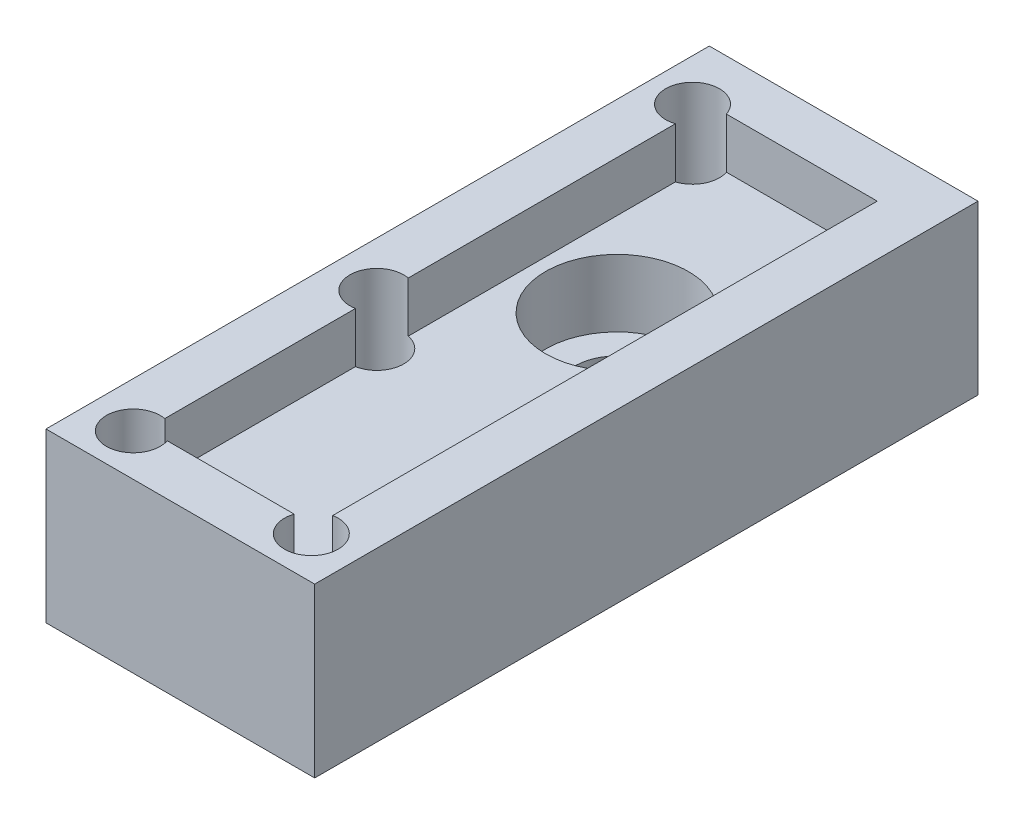
ISO-10303-21;
HEADER;
FILE_DESCRIPTION(('STEP AP214'),'2;1');
FILE_NAME('part.step','',(''),(''),'','','');
FILE_SCHEMA(('AUTOMOTIVE_DESIGN { 1 0 10303 214 1 1 1 1 }'));
ENDSEC;
DATA;
#1=APPLICATION_CONTEXT('core data for automotive mechanical design processes');
#2=APPLICATION_PROTOCOL_DEFINITION('international standard','automotive_design',2000,#1);
#3=PRODUCT_CONTEXT('',#1,'mechanical');
#4=PRODUCT('Part','Part','',(#3));
#5=PRODUCT_RELATED_PRODUCT_CATEGORY('part','',(#4));
#6=PRODUCT_DEFINITION_FORMATION('','',#4);
#7=PRODUCT_DEFINITION_CONTEXT('part definition',#1,'design');
#8=PRODUCT_DEFINITION('design','',#6,#7);
#9=PRODUCT_DEFINITION_SHAPE('','',#8);
#10=(LENGTH_UNIT() NAMED_UNIT(*) SI_UNIT(.MILLI.,.METRE.));
#11=(NAMED_UNIT(*) PLANE_ANGLE_UNIT() SI_UNIT($,.RADIAN.));
#12=(NAMED_UNIT(*) SI_UNIT($,.STERADIAN.) SOLID_ANGLE_UNIT());
#13=UNCERTAINTY_MEASURE_WITH_UNIT(LENGTH_MEASURE(1.E-05),#10,'distance_accuracy_value','');
#14=(GEOMETRIC_REPRESENTATION_CONTEXT(3) GLOBAL_UNCERTAINTY_ASSIGNED_CONTEXT((#13)) GLOBAL_UNIT_ASSIGNED_CONTEXT((#10,
#11,#12)) REPRESENTATION_CONTEXT('',''));
#15=CARTESIAN_POINT('',(0.,0.,0.));
#16=DIRECTION('',(0.,0.,1.));
#17=DIRECTION('',(1.,0.,0.));
#18=AXIS2_PLACEMENT_3D('',#15,#16,#17);
#19=CARTESIAN_POINT('',(8.,-8.,-26.));
#20=DIRECTION('',(0.,1.,0.));
#21=DIRECTION('',(0.,0.,1.));
#22=AXIS2_PLACEMENT_3D('',#19,#20,#21);
#23=CYLINDRICAL_SURFACE('',#22,2.5);
#24=CARTESIAN_POINT('',(8.,8.,-26.));
#25=DIRECTION('',(0.,1.,0.));
#26=DIRECTION('',(0.,0.,1.));
#27=AXIS2_PLACEMENT_3D('',#24,#25,#26);
#28=CIRCLE('',#27,2.5);
#29=CARTESIAN_POINT('',(8.,8.,-23.5));
#30=VERTEX_POINT('',#29);
#31=EDGE_CURVE('E165',#30,#30,#28,.F.);
#32=ORIENTED_EDGE('',*,*,#31,.F.);
#33=EDGE_LOOP('',(#32));
#34=FACE_BOUND('',#33,.T.);
#35=CARTESIAN_POINT('',(8.,5.,-26.));
#36=DIRECTION('',(0.,-1.,0.));
#37=DIRECTION('',(0.,0.,-1.));
#38=AXIS2_PLACEMENT_3D('',#35,#36,#37);
#39=CIRCLE('',#38,2.5);
#40=CARTESIAN_POINT('',(8.,5.,-28.5));
#41=VERTEX_POINT('',#40);
#42=EDGE_CURVE('E179',#41,#41,#39,.F.);
#43=ORIENTED_EDGE('',*,*,#42,.F.);
#44=EDGE_LOOP('',(#43));
#45=FACE_BOUND('',#44,.T.);
#46=ADVANCED_FACE('F33',(#34,#45),#23,.F.);
#47=CARTESIAN_POINT('',(0.,15.,0.));
#48=DIRECTION('',(1.,0.,0.));
#49=DIRECTION('',(0.,0.,-1.));
#50=AXIS2_PLACEMENT_3D('',#47,#48,#49);
#51=PLANE('',#50);
#52=DIRECTION('',(0.,0.,-1.));
#53=VECTOR('',#52,1.);
#54=CARTESIAN_POINT('',(0.,5.,0.));
#55=LINE('',#54,#53);
#56=CARTESIAN_POINT('',(0.,5.,0.));
#57=VERTEX_POINT('',#56);
#58=CARTESIAN_POINT('',(0.,5.,-39.5));
#59=VERTEX_POINT('',#58);
#60=EDGE_CURVE('E50',#57,#59,#55,.T.);
#61=ORIENTED_EDGE('',*,*,#60,.F.);
#62=DIRECTION('',(0.,-1.,0.));
#63=VECTOR('',#62,1.);
#64=CARTESIAN_POINT('',(0.,15.,0.));
#65=LINE('',#64,#63);
#66=CARTESIAN_POINT('',(0.,15.,0.));
#67=VERTEX_POINT('',#66);
#68=EDGE_CURVE('E153',#67,#57,#65,.T.);
#69=ORIENTED_EDGE('',*,*,#68,.F.);
#70=DIRECTION('',(0.,0.,1.));
#71=VECTOR('',#70,1.);
#72=CARTESIAN_POINT('',(0.,15.,0.));
#73=LINE('',#72,#71);
#74=CARTESIAN_POINT('',(0.,15.,-39.5));
#75=VERTEX_POINT('',#74);
#76=EDGE_CURVE('E231',#75,#67,#73,.T.);
#77=ORIENTED_EDGE('',*,*,#76,.F.);
#78=DIRECTION('',(0.,-1.,0.));
#79=VECTOR('',#78,1.);
#80=CARTESIAN_POINT('',(0.,15.,-39.5));
#81=LINE('',#80,#79);
#82=EDGE_CURVE('E151',#75,#59,#81,.T.);
#83=ORIENTED_EDGE('',*,*,#82,.T.);
#84=EDGE_LOOP('',(#61,#69,#77,#83));
#85=FACE_BOUND('',#84,.T.);
#86=ADVANCED_FACE('F35',(#85),#51,.F.);
#87=CARTESIAN_POINT('',(0.,15.,0.));
#88=DIRECTION('',(0.,0.,-1.));
#89=DIRECTION('',(-1.,0.,0.));
#90=AXIS2_PLACEMENT_3D('',#87,#88,#89);
#91=PLANE('',#90);
#92=DIRECTION('',(-1.,0.,0.));
#93=VECTOR('',#92,1.);
#94=CARTESIAN_POINT('',(0.,5.,0.));
#95=LINE('',#94,#93);
#96=CARTESIAN_POINT('',(16.,5.,0.));
#97=VERTEX_POINT('',#96);
#98=EDGE_CURVE('E147',#97,#57,#95,.T.);
#99=ORIENTED_EDGE('',*,*,#98,.F.);
#100=DIRECTION('',(0.,-1.,0.));
#101=VECTOR('',#100,1.);
#102=CARTESIAN_POINT('',(16.,15.,0.));
#103=LINE('',#102,#101);
#104=CARTESIAN_POINT('',(16.,15.,0.));
#105=VERTEX_POINT('',#104);
#106=EDGE_CURVE('E146',#105,#97,#103,.T.);
#107=ORIENTED_EDGE('',*,*,#106,.F.);
#108=DIRECTION('',(1.,0.,0.));
#109=VECTOR('',#108,1.);
#110=CARTESIAN_POINT('',(0.,15.,0.));
#111=LINE('',#110,#109);
#112=EDGE_CURVE('E234',#67,#105,#111,.T.);
#113=ORIENTED_EDGE('',*,*,#112,.F.);
#114=ORIENTED_EDGE('',*,*,#68,.T.);
#115=EDGE_LOOP('',(#99,#107,#113,#114));
#116=FACE_BOUND('',#115,.T.);
#117=ADVANCED_FACE('F243',(#116),#91,.F.);
#118=CARTESIAN_POINT('',(16.,15.,0.));
#119=DIRECTION('',(-1.,0.,0.));
#120=DIRECTION('',(0.,0.,1.));
#121=AXIS2_PLACEMENT_3D('',#118,#119,#120);
#122=PLANE('',#121);
#123=DIRECTION('',(0.,0.,1.));
#124=VECTOR('',#123,1.);
#125=CARTESIAN_POINT('',(16.,5.,0.));
#126=LINE('',#125,#124);
#127=CARTESIAN_POINT('',(16.,5.,-39.5));
#128=VERTEX_POINT('',#127);
#129=EDGE_CURVE('E130',#128,#97,#126,.T.);
#130=ORIENTED_EDGE('',*,*,#129,.F.);
#131=DIRECTION('',(0.,-1.,0.));
#132=VECTOR('',#131,1.);
#133=CARTESIAN_POINT('',(16.,15.,-39.5));
#134=LINE('',#133,#132);
#135=CARTESIAN_POINT('',(16.,15.,-39.5));
#136=VERTEX_POINT('',#135);
#137=EDGE_CURVE('E143',#136,#128,#134,.T.);
#138=ORIENTED_EDGE('',*,*,#137,.F.);
#139=DIRECTION('',(0.,0.,-1.));
#140=VECTOR('',#139,1.);
#141=CARTESIAN_POINT('',(16.,15.,0.));
#142=LINE('',#141,#140);
#143=EDGE_CURVE('E236',#105,#136,#142,.T.);
#144=ORIENTED_EDGE('',*,*,#143,.F.);
#145=ORIENTED_EDGE('',*,*,#106,.T.);
#146=EDGE_LOOP('',(#130,#138,#144,#145));
#147=FACE_BOUND('',#146,.T.);
#148=ADVANCED_FACE('F141',(#147),#122,.F.);
#149=CARTESIAN_POINT('',(0.,15.,-39.5));
#150=DIRECTION('',(0.,0.,1.));
#151=DIRECTION('',(1.,0.,0.));
#152=AXIS2_PLACEMENT_3D('',#149,#150,#151);
#153=PLANE('',#152);
#154=DIRECTION('',(1.,0.,0.));
#155=VECTOR('',#154,1.);
#156=CARTESIAN_POINT('',(0.,5.,-39.5));
#157=LINE('',#156,#155);
#158=EDGE_CURVE('E126',#59,#128,#157,.T.);
#159=ORIENTED_EDGE('',*,*,#158,.F.);
#160=ORIENTED_EDGE('',*,*,#82,.F.);
#161=DIRECTION('',(-1.,0.,0.));
#162=VECTOR('',#161,1.);
#163=CARTESIAN_POINT('',(0.,15.,-39.5));
#164=LINE('',#163,#162);
#165=EDGE_CURVE('E150',#136,#75,#164,.T.);
#166=ORIENTED_EDGE('',*,*,#165,.F.);
#167=ORIENTED_EDGE('',*,*,#137,.T.);
#168=EDGE_LOOP('',(#159,#160,#166,#167));
#169=FACE_BOUND('',#168,.T.);
#170=ADVANCED_FACE('F149',(#169),#153,.F.);
#171=CARTESIAN_POINT('',(2.7,0.,-2.5));
#172=DIRECTION('',(0.,1.,0.));
#173=DIRECTION('',(0.,0.,1.));
#174=AXIS2_PLACEMENT_3D('',#171,#172,#173);
#175=CYLINDRICAL_SURFACE('',#174,1.6);
#176=CARTESIAN_POINT('',(2.7,15.,-2.5));
#177=DIRECTION('',(0.,1.,0.));
#178=DIRECTION('',(0.,0.,1.));
#179=AXIS2_PLACEMENT_3D('',#176,#177,#178);
#180=CIRCLE('',#179,1.6);
#181=CARTESIAN_POINT('',(3.,15.,-4.07162336455017));
#182=VERTEX_POINT('',#181);
#183=CARTESIAN_POINT('',(4.21986841535707,15.,-3.));
#184=VERTEX_POINT('',#183);
#185=EDGE_CURVE('E198',#182,#184,#180,.T.);
#186=ORIENTED_EDGE('',*,*,#185,.T.);
#187=DIRECTION('',(0.,1.,0.));
#188=VECTOR('',#187,1.);
#189=CARTESIAN_POINT('',(4.21986841535707,0.,-3.));
#190=LINE('',#189,#188);
#191=CARTESIAN_POINT('',(4.21986841535707,12.,-3.));
#192=VERTEX_POINT('',#191);
#193=EDGE_CURVE('E200',#192,#184,#190,.T.);
#194=ORIENTED_EDGE('',*,*,#193,.F.);
#195=CARTESIAN_POINT('',(2.7,12.,-2.5));
#196=DIRECTION('',(0.,-1.,0.));
#197=DIRECTION('',(0.,0.,-1.));
#198=AXIS2_PLACEMENT_3D('',#195,#196,#197);
#199=CIRCLE('',#198,1.6);
#200=CARTESIAN_POINT('',(3.,12.,-4.07162336455017));
#201=VERTEX_POINT('',#200);
#202=EDGE_CURVE('E160',#201,#192,#199,.T.);
#203=ORIENTED_EDGE('',*,*,#202,.F.);
#204=DIRECTION('',(0.,1.,0.));
#205=VECTOR('',#204,1.);
#206=CARTESIAN_POINT('',(3.,0.,-4.07162336455017));
#207=LINE('',#206,#205);
#208=EDGE_CURVE('E203',#182,#201,#207,.F.);
#209=ORIENTED_EDGE('',*,*,#208,.F.);
#210=EDGE_LOOP('',(#186,#194,#203,#209));
#211=FACE_BOUND('',#210,.T.);
#212=CARTESIAN_POINT('',(2.7,5.,-2.5));
#213=DIRECTION('',(0.,-1.,0.));
#214=DIRECTION('',(0.,0.,-1.));
#215=AXIS2_PLACEMENT_3D('',#212,#213,#214);
#216=CIRCLE('',#215,1.6);
#217=CARTESIAN_POINT('',(2.7,5.,-4.1));
#218=VERTEX_POINT('',#217);
#219=EDGE_CURVE('E136',#218,#218,#216,.F.);
#220=ORIENTED_EDGE('',*,*,#219,.F.);
#221=EDGE_LOOP('',(#220));
#222=FACE_BOUND('',#221,.T.);
#223=ADVANCED_FACE('F271',(#211,#222),#175,.F.);
#224=CARTESIAN_POINT('',(2.5,18.,-36.));
#225=DIRECTION('',(0.,-1.,0.));
#226=DIRECTION('',(0.,0.,-1.));
#227=AXIS2_PLACEMENT_3D('',#224,#225,#226);
#228=CYLINDRICAL_SURFACE('',#227,1.6);
#229=CARTESIAN_POINT('',(2.5,15.,-36.));
#230=DIRECTION('',(0.,-1.,0.));
#231=DIRECTION('',(0.,0.,-1.));
#232=AXIS2_PLACEMENT_3D('',#229,#230,#231);
#233=CIRCLE('',#232,1.6);
#234=CARTESIAN_POINT('',(4.01986841535706,15.,-36.5));
#235=VERTEX_POINT('',#234);
#236=CARTESIAN_POINT('',(3.,15.,-34.4801315846429));
#237=VERTEX_POINT('',#236);
#238=EDGE_CURVE('E185',#235,#237,#233,.F.);
#239=ORIENTED_EDGE('',*,*,#238,.T.);
#240=DIRECTION('',(0.,-1.,0.));
#241=VECTOR('',#240,1.);
#242=CARTESIAN_POINT('',(3.,18.,-34.4801315846429));
#243=LINE('',#242,#241);
#244=CARTESIAN_POINT('',(3.,12.,-34.4801315846429));
#245=VERTEX_POINT('',#244);
#246=EDGE_CURVE('E171',#237,#245,#243,.T.);
#247=ORIENTED_EDGE('',*,*,#246,.T.);
#248=CARTESIAN_POINT('',(2.5,12.,-36.));
#249=DIRECTION('',(0.,-1.,0.));
#250=DIRECTION('',(0.,0.,-1.));
#251=AXIS2_PLACEMENT_3D('',#248,#249,#250);
#252=CIRCLE('',#251,1.6);
#253=CARTESIAN_POINT('',(4.01986841535706,12.,-36.5));
#254=VERTEX_POINT('',#253);
#255=EDGE_CURVE('E163',#245,#254,#252,.F.);
#256=ORIENTED_EDGE('',*,*,#255,.T.);
#257=DIRECTION('',(0.,-1.,0.));
#258=VECTOR('',#257,1.);
#259=CARTESIAN_POINT('',(4.01986841535706,18.,-36.5));
#260=LINE('',#259,#258);
#261=EDGE_CURVE('E167',#254,#235,#260,.F.);
#262=ORIENTED_EDGE('',*,*,#261,.T.);
#263=EDGE_LOOP('',(#239,#247,#256,#262));
#264=FACE_BOUND('',#263,.T.);
#265=CARTESIAN_POINT('',(2.5,5.,-36.));
#266=DIRECTION('',(0.,-1.,0.));
#267=DIRECTION('',(0.,0.,-1.));
#268=AXIS2_PLACEMENT_3D('',#265,#266,#267);
#269=CIRCLE('',#268,1.6);
#270=CARTESIAN_POINT('',(2.5,5.,-37.6));
#271=VERTEX_POINT('',#270);
#272=EDGE_CURVE('E248',#271,#271,#269,.T.);
#273=ORIENTED_EDGE('',*,*,#272,.T.);
#274=EDGE_LOOP('',(#273));
#275=FACE_BOUND('',#274,.T.);
#276=ADVANCED_FACE('F268',(#264,#275),#228,.F.);
#277=CARTESIAN_POINT('',(2.7,18.,-17.));
#278=DIRECTION('',(0.,-1.,0.));
#279=DIRECTION('',(0.,0.,-1.));
#280=AXIS2_PLACEMENT_3D('',#277,#278,#279);
#281=CYLINDRICAL_SURFACE('',#280,1.6);
#282=CARTESIAN_POINT('',(2.7,15.,-17.));
#283=DIRECTION('',(0.,-1.,0.));
#284=DIRECTION('',(0.,0.,-1.));
#285=AXIS2_PLACEMENT_3D('',#282,#283,#284);
#286=CIRCLE('',#285,1.6);
#287=CARTESIAN_POINT('',(3.,15.,-18.5716233645502));
#288=VERTEX_POINT('',#287);
#289=CARTESIAN_POINT('',(3.,15.,-15.4283766354498));
#290=VERTEX_POINT('',#289);
#291=EDGE_CURVE('E191',#288,#290,#286,.F.);
#292=ORIENTED_EDGE('',*,*,#291,.T.);
#293=DIRECTION('',(0.,-1.,0.));
#294=VECTOR('',#293,1.);
#295=CARTESIAN_POINT('',(3.,18.,-15.4283766354498));
#296=LINE('',#295,#294);
#297=CARTESIAN_POINT('',(3.,12.,-15.4283766354498));
#298=VERTEX_POINT('',#297);
#299=EDGE_CURVE('E187',#290,#298,#296,.T.);
#300=ORIENTED_EDGE('',*,*,#299,.T.);
#301=CARTESIAN_POINT('',(2.7,12.,-17.));
#302=DIRECTION('',(0.,-1.,0.));
#303=DIRECTION('',(0.,0.,-1.));
#304=AXIS2_PLACEMENT_3D('',#301,#302,#303);
#305=CIRCLE('',#304,1.6);
#306=CARTESIAN_POINT('',(3.,12.,-18.5716233645502));
#307=VERTEX_POINT('',#306);
#308=EDGE_CURVE('E42',#298,#307,#305,.F.);
#309=ORIENTED_EDGE('',*,*,#308,.T.);
#310=DIRECTION('',(0.,-1.,0.));
#311=VECTOR('',#310,1.);
#312=CARTESIAN_POINT('',(3.,18.,-18.5716233645502));
#313=LINE('',#312,#311);
#314=EDGE_CURVE('E189',#307,#288,#313,.F.);
#315=ORIENTED_EDGE('',*,*,#314,.T.);
#316=EDGE_LOOP('',(#292,#300,#309,#315));
#317=FACE_BOUND('',#316,.T.);
#318=CARTESIAN_POINT('',(2.7,5.,-17.));
#319=DIRECTION('',(0.,-1.,0.));
#320=DIRECTION('',(0.,0.,-1.));
#321=AXIS2_PLACEMENT_3D('',#318,#319,#320);
#322=CIRCLE('',#321,1.6);
#323=CARTESIAN_POINT('',(2.7,5.,-18.6));
#324=VERTEX_POINT('',#323);
#325=EDGE_CURVE('E251',#324,#324,#322,.T.);
#326=ORIENTED_EDGE('',*,*,#325,.T.);
#327=EDGE_LOOP('',(#326));
#328=FACE_BOUND('',#327,.T.);
#329=ADVANCED_FACE('F270',(#317,#328),#281,.F.);
#330=CARTESIAN_POINT('',(13.3,18.,-2.5));
#331=DIRECTION('',(0.,-1.,0.));
#332=DIRECTION('',(0.,0.,-1.));
#333=AXIS2_PLACEMENT_3D('',#330,#331,#332);
#334=CYLINDRICAL_SURFACE('',#333,1.6);
#335=CARTESIAN_POINT('',(13.3,15.,-2.5));
#336=DIRECTION('',(0.,-1.,0.));
#337=DIRECTION('',(0.,0.,-1.));
#338=AXIS2_PLACEMENT_3D('',#335,#336,#337);
#339=CIRCLE('',#338,1.6);
#340=CARTESIAN_POINT('',(11.7801315846429,15.,-3.));
#341=VERTEX_POINT('',#340);
#342=CARTESIAN_POINT('',(13.,15.,-4.07162336455017));
#343=VERTEX_POINT('',#342);
#344=EDGE_CURVE('E196',#341,#343,#339,.F.);
#345=ORIENTED_EDGE('',*,*,#344,.T.);
#346=DIRECTION('',(0.,-1.,0.));
#347=VECTOR('',#346,1.);
#348=CARTESIAN_POINT('',(13.,18.,-4.07162336455017));
#349=LINE('',#348,#347);
#350=CARTESIAN_POINT('',(13.,12.,-4.07162336455017));
#351=VERTEX_POINT('',#350);
#352=EDGE_CURVE('E57',#343,#351,#349,.T.);
#353=ORIENTED_EDGE('',*,*,#352,.T.);
#354=CARTESIAN_POINT('',(13.3,12.,-2.5));
#355=DIRECTION('',(0.,-1.,0.));
#356=DIRECTION('',(0.,0.,-1.));
#357=AXIS2_PLACEMENT_3D('',#354,#355,#356);
#358=CIRCLE('',#357,1.6);
#359=CARTESIAN_POINT('',(11.7801315846429,12.,-3.));
#360=VERTEX_POINT('',#359);
#361=EDGE_CURVE('E11',#351,#360,#358,.F.);
#362=ORIENTED_EDGE('',*,*,#361,.T.);
#363=DIRECTION('',(0.,-1.,0.));
#364=VECTOR('',#363,1.);
#365=CARTESIAN_POINT('',(11.7801315846429,18.,-3.));
#366=LINE('',#365,#364);
#367=EDGE_CURVE('E193',#360,#341,#366,.F.);
#368=ORIENTED_EDGE('',*,*,#367,.T.);
#369=EDGE_LOOP('',(#345,#353,#362,#368));
#370=FACE_BOUND('',#369,.T.);
#371=CARTESIAN_POINT('',(13.3,5.,-2.5));
#372=DIRECTION('',(0.,-1.,0.));
#373=DIRECTION('',(0.,0.,-1.));
#374=AXIS2_PLACEMENT_3D('',#371,#372,#373);
#375=CIRCLE('',#374,1.6);
#376=CARTESIAN_POINT('',(13.3,5.,-4.1));
#377=VERTEX_POINT('',#376);
#378=EDGE_CURVE('E37',#377,#377,#375,.T.);
#379=ORIENTED_EDGE('',*,*,#378,.T.);
#380=EDGE_LOOP('',(#379));
#381=FACE_BOUND('',#380,.T.);
#382=ADVANCED_FACE('F258',(#370,#381),#334,.F.);
#383=CARTESIAN_POINT('',(3.,12.,-3.));
#384=DIRECTION('',(-1.,0.,0.));
#385=DIRECTION('',(0.,0.,1.));
#386=AXIS2_PLACEMENT_3D('',#383,#384,#385);
#387=PLANE('',#386);
#388=ORIENTED_EDGE('',*,*,#314,.F.);
#389=DIRECTION('',(0.,0.,1.));
#390=VECTOR('',#389,1.);
#391=CARTESIAN_POINT('',(3.,12.,-3.));
#392=LINE('',#391,#390);
#393=EDGE_CURVE('E209',#245,#307,#392,.T.);
#394=ORIENTED_EDGE('',*,*,#393,.F.);
#395=ORIENTED_EDGE('',*,*,#246,.F.);
#396=DIRECTION('',(0.,0.,1.));
#397=VECTOR('',#396,1.);
#398=CARTESIAN_POINT('',(3.,15.,-3.));
#399=LINE('',#398,#397);
#400=EDGE_CURVE('E221',#237,#288,#399,.T.);
#401=ORIENTED_EDGE('',*,*,#400,.T.);
#402=EDGE_LOOP('',(#388,#394,#395,#401));
#403=FACE_BOUND('',#402,.T.);
#404=ADVANCED_FACE('F293',(#403),#387,.F.);
#405=ORIENTED_EDGE('',*,*,#299,.F.);
#406=EDGE_CURVE('E206',#290,#182,#399,.T.);
#407=ORIENTED_EDGE('',*,*,#406,.T.);
#408=ORIENTED_EDGE('',*,*,#208,.T.);
#409=EDGE_CURVE('E207',#298,#201,#392,.T.);
#410=ORIENTED_EDGE('',*,*,#409,.F.);
#411=EDGE_LOOP('',(#405,#407,#408,#410));
#412=FACE_BOUND('',#411,.T.);
#413=ADVANCED_FACE('F297',(#412),#387,.F.);
#414=CARTESIAN_POINT('',(3.,12.,-36.5));
#415=DIRECTION('',(0.,0.,-1.));
#416=DIRECTION('',(-1.,0.,0.));
#417=AXIS2_PLACEMENT_3D('',#414,#415,#416);
#418=PLANE('',#417);
#419=ORIENTED_EDGE('',*,*,#261,.F.);
#420=DIRECTION('',(-1.,0.,0.));
#421=VECTOR('',#420,1.);
#422=CARTESIAN_POINT('',(3.,12.,-36.5));
#423=LINE('',#422,#421);
#424=CARTESIAN_POINT('',(13.,12.,-36.5));
#425=VERTEX_POINT('',#424);
#426=EDGE_CURVE('E216',#425,#254,#423,.T.);
#427=ORIENTED_EDGE('',*,*,#426,.F.);
#428=DIRECTION('',(0.,1.,0.));
#429=VECTOR('',#428,1.);
#430=CARTESIAN_POINT('',(13.,12.,-36.5));
#431=LINE('',#430,#429);
#432=CARTESIAN_POINT('',(13.,15.,-36.5));
#433=VERTEX_POINT('',#432);
#434=EDGE_CURVE('E219',#425,#433,#431,.T.);
#435=ORIENTED_EDGE('',*,*,#434,.T.);
#436=DIRECTION('',(-1.,0.,0.));
#437=VECTOR('',#436,1.);
#438=CARTESIAN_POINT('',(3.,15.,-36.5));
#439=LINE('',#438,#437);
#440=EDGE_CURVE('E210',#433,#235,#439,.T.);
#441=ORIENTED_EDGE('',*,*,#440,.T.);
#442=EDGE_LOOP('',(#419,#427,#435,#441));
#443=FACE_BOUND('',#442,.T.);
#444=ADVANCED_FACE('F314',(#443),#418,.F.);
#445=CARTESIAN_POINT('',(13.,12.,-3.));
#446=DIRECTION('',(1.,0.,0.));
#447=DIRECTION('',(0.,0.,-1.));
#448=AXIS2_PLACEMENT_3D('',#445,#446,#447);
#449=PLANE('',#448);
#450=ORIENTED_EDGE('',*,*,#352,.F.);
#451=DIRECTION('',(0.,0.,-1.));
#452=VECTOR('',#451,1.);
#453=CARTESIAN_POINT('',(13.,15.,-3.));
#454=LINE('',#453,#452);
#455=EDGE_CURVE('E225',#343,#433,#454,.T.);
#456=ORIENTED_EDGE('',*,*,#455,.T.);
#457=ORIENTED_EDGE('',*,*,#434,.F.);
#458=DIRECTION('',(0.,0.,-1.));
#459=VECTOR('',#458,1.);
#460=CARTESIAN_POINT('',(13.,12.,-3.));
#461=LINE('',#460,#459);
#462=EDGE_CURVE('E214',#351,#425,#461,.T.);
#463=ORIENTED_EDGE('',*,*,#462,.F.);
#464=EDGE_LOOP('',(#450,#456,#457,#463));
#465=FACE_BOUND('',#464,.T.);
#466=ADVANCED_FACE('F307',(#465),#449,.F.);
#467=CARTESIAN_POINT('',(3.,12.,-3.));
#468=DIRECTION('',(0.,0.,1.));
#469=DIRECTION('',(1.,0.,0.));
#470=AXIS2_PLACEMENT_3D('',#467,#468,#469);
#471=PLANE('',#470);
#472=ORIENTED_EDGE('',*,*,#367,.F.);
#473=DIRECTION('',(1.,0.,0.));
#474=VECTOR('',#473,1.);
#475=CARTESIAN_POINT('',(3.,12.,-3.));
#476=LINE('',#475,#474);
#477=EDGE_CURVE('E211',#192,#360,#476,.T.);
#478=ORIENTED_EDGE('',*,*,#477,.F.);
#479=ORIENTED_EDGE('',*,*,#193,.T.);
#480=DIRECTION('',(1.,0.,0.));
#481=VECTOR('',#480,1.);
#482=CARTESIAN_POINT('',(3.,15.,-3.));
#483=LINE('',#482,#481);
#484=EDGE_CURVE('E222',#184,#341,#483,.T.);
#485=ORIENTED_EDGE('',*,*,#484,.T.);
#486=EDGE_LOOP('',(#472,#478,#479,#485));
#487=FACE_BOUND('',#486,.T.);
#488=ADVANCED_FACE('F323',(#487),#471,.F.);
#489=CARTESIAN_POINT('',(0.,15.,0.));
#490=DIRECTION('',(0.,-1.,0.));
#491=DIRECTION('',(0.,0.,-1.));
#492=AXIS2_PLACEMENT_3D('',#489,#490,#491);
#493=PLANE('',#492);
#494=ORIENTED_EDGE('',*,*,#344,.F.);
#495=ORIENTED_EDGE('',*,*,#484,.F.);
#496=ORIENTED_EDGE('',*,*,#185,.F.);
#497=ORIENTED_EDGE('',*,*,#406,.F.);
#498=ORIENTED_EDGE('',*,*,#291,.F.);
#499=ORIENTED_EDGE('',*,*,#400,.F.);
#500=ORIENTED_EDGE('',*,*,#238,.F.);
#501=ORIENTED_EDGE('',*,*,#440,.F.);
#502=ORIENTED_EDGE('',*,*,#455,.F.);
#503=EDGE_LOOP('',(#494,#495,#496,#497,#498,#499,#500,#501,#502));
#504=FACE_BOUND('',#503,.T.);
#505=ORIENTED_EDGE('',*,*,#76,.T.);
#506=ORIENTED_EDGE('',*,*,#112,.T.);
#507=ORIENTED_EDGE('',*,*,#143,.T.);
#508=ORIENTED_EDGE('',*,*,#165,.T.);
#509=EDGE_LOOP('',(#505,#506,#507,#508));
#510=FACE_BOUND('',#509,.T.);
#511=ADVANCED_FACE('F238',(#504,#510),#493,.F.);
#512=CARTESIAN_POINT('',(0.,12.,0.));
#513=DIRECTION('',(0.,-1.,0.));
#514=DIRECTION('',(0.,0.,-1.));
#515=AXIS2_PLACEMENT_3D('',#512,#513,#514);
#516=PLANE('',#515);
#517=CARTESIAN_POINT('',(8.,12.,-26.));
#518=DIRECTION('',(0.,1.,0.));
#519=DIRECTION('',(0.,0.,1.));
#520=AXIS2_PLACEMENT_3D('',#517,#518,#519);
#521=CIRCLE('',#520,4.25);
#522=CARTESIAN_POINT('',(8.,12.,-21.75));
#523=VERTEX_POINT('',#522);
#524=EDGE_CURVE('E174',#523,#523,#521,.T.);
#525=ORIENTED_EDGE('',*,*,#524,.F.);
#526=EDGE_LOOP('',(#525));
#527=FACE_BOUND('',#526,.T.);
#528=ORIENTED_EDGE('',*,*,#361,.F.);
#529=ORIENTED_EDGE('',*,*,#462,.T.);
#530=ORIENTED_EDGE('',*,*,#426,.T.);
#531=ORIENTED_EDGE('',*,*,#255,.F.);
#532=ORIENTED_EDGE('',*,*,#393,.T.);
#533=ORIENTED_EDGE('',*,*,#308,.F.);
#534=ORIENTED_EDGE('',*,*,#409,.T.);
#535=ORIENTED_EDGE('',*,*,#202,.T.);
#536=ORIENTED_EDGE('',*,*,#477,.T.);
#537=EDGE_LOOP('',(#528,#529,#530,#531,#532,#533,#534,#535,#536));
#538=FACE_BOUND('',#537,.T.);
#539=ADVANCED_FACE('F318',(#527,#538),#516,.F.);
#540=CARTESIAN_POINT('',(8.,8.,-26.));
#541=DIRECTION('',(0.,1.,0.));
#542=DIRECTION('',(0.,0.,1.));
#543=AXIS2_PLACEMENT_3D('',#540,#541,#542);
#544=PLANE('',#543);
#545=CARTESIAN_POINT('',(8.,8.,-26.));
#546=DIRECTION('',(0.,1.,0.));
#547=DIRECTION('',(0.,0.,1.));
#548=AXIS2_PLACEMENT_3D('',#545,#546,#547);
#549=CIRCLE('',#548,4.25);
#550=CARTESIAN_POINT('',(8.,8.,-21.75));
#551=VERTEX_POINT('',#550);
#552=EDGE_CURVE('E168',#551,#551,#549,.T.);
#553=ORIENTED_EDGE('',*,*,#552,.T.);
#554=EDGE_LOOP('',(#553));
#555=FACE_BOUND('',#554,.T.);
#556=ORIENTED_EDGE('',*,*,#31,.T.);
#557=EDGE_LOOP('',(#556));
#558=FACE_BOUND('',#557,.T.);
#559=ADVANCED_FACE('F397',(#555,#558),#544,.T.);
#560=CARTESIAN_POINT('',(8.,8.,-26.));
#561=DIRECTION('',(0.,1.,0.));
#562=DIRECTION('',(0.,0.,1.));
#563=AXIS2_PLACEMENT_3D('',#560,#561,#562);
#564=CYLINDRICAL_SURFACE('',#563,4.25);
#565=ORIENTED_EDGE('',*,*,#552,.F.);
#566=EDGE_LOOP('',(#565));
#567=FACE_BOUND('',#566,.T.);
#568=ORIENTED_EDGE('',*,*,#524,.T.);
#569=EDGE_LOOP('',(#568));
#570=FACE_BOUND('',#569,.T.);
#571=ADVANCED_FACE('F262',(#567,#570),#564,.F.);
#572=CARTESIAN_POINT('',(0.,5.,0.));
#573=DIRECTION('',(0.,-1.,0.));
#574=DIRECTION('',(0.,0.,-1.));
#575=AXIS2_PLACEMENT_3D('',#572,#573,#574);
#576=PLANE('',#575);
#577=ORIENTED_EDGE('',*,*,#219,.T.);
#578=EDGE_LOOP('',(#577));
#579=FACE_BOUND('',#578,.T.);
#580=ORIENTED_EDGE('',*,*,#378,.F.);
#581=EDGE_LOOP('',(#580));
#582=FACE_BOUND('',#581,.T.);
#583=ORIENTED_EDGE('',*,*,#325,.F.);
#584=EDGE_LOOP('',(#583));
#585=FACE_BOUND('',#584,.T.);
#586=ORIENTED_EDGE('',*,*,#272,.F.);
#587=EDGE_LOOP('',(#586));
#588=FACE_BOUND('',#587,.T.);
#589=ORIENTED_EDGE('',*,*,#60,.T.);
#590=ORIENTED_EDGE('',*,*,#158,.T.);
#591=ORIENTED_EDGE('',*,*,#129,.T.);
#592=ORIENTED_EDGE('',*,*,#98,.T.);
#593=EDGE_LOOP('',(#589,#590,#591,#592));
#594=FACE_BOUND('',#593,.T.);
#595=ORIENTED_EDGE('',*,*,#42,.T.);
#596=EDGE_LOOP('',(#595));
#597=FACE_BOUND('',#596,.T.);
#598=ADVANCED_FACE('F128',(#579,#582,#585,#588,#594,#597),#576,.T.);
#599=CLOSED_SHELL('',(#46,#86,#117,#148,#170,#223,#276,#329,#382,#404,#413,#444,#466,#488,#511,
#539,#559,#571,#598));
#600=MANIFOLD_SOLID_BREP('B2',#599);
#601=ADVANCED_BREP_SHAPE_REPRESENTATION('',(#18,#600),#14);
#602=SHAPE_DEFINITION_REPRESENTATION(#9,#601);
ENDSEC;
END-ISO-10303-21;
